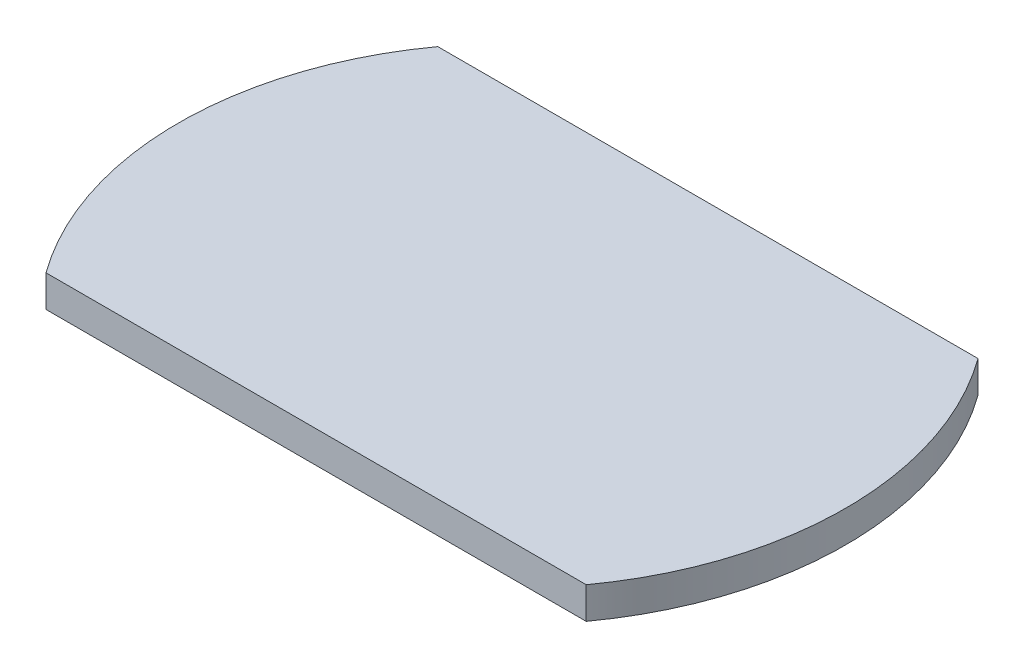
ISO-10303-21;
HEADER;
FILE_DESCRIPTION(('STEP AP214'),'2;1');
FILE_NAME('part.step','',(''),(''),'','','');
FILE_SCHEMA(('AUTOMOTIVE_DESIGN { 1 0 10303 214 1 1 1 1 }'));
ENDSEC;
DATA;
#1=APPLICATION_CONTEXT('core data for automotive mechanical design processes');
#2=APPLICATION_PROTOCOL_DEFINITION('international standard','automotive_design',2000,#1);
#3=PRODUCT_CONTEXT('',#1,'mechanical');
#4=PRODUCT('Part','Part','',(#3));
#5=PRODUCT_RELATED_PRODUCT_CATEGORY('part','',(#4));
#6=PRODUCT_DEFINITION_FORMATION('','',#4);
#7=PRODUCT_DEFINITION_CONTEXT('part definition',#1,'design');
#8=PRODUCT_DEFINITION('design','',#6,#7);
#9=PRODUCT_DEFINITION_SHAPE('','',#8);
#10=(LENGTH_UNIT() NAMED_UNIT(*) SI_UNIT(.MILLI.,.METRE.));
#11=(NAMED_UNIT(*) PLANE_ANGLE_UNIT() SI_UNIT($,.RADIAN.));
#12=(NAMED_UNIT(*) SI_UNIT($,.STERADIAN.) SOLID_ANGLE_UNIT());
#13=UNCERTAINTY_MEASURE_WITH_UNIT(LENGTH_MEASURE(1.E-05),#10,'distance_accuracy_value','');
#14=(GEOMETRIC_REPRESENTATION_CONTEXT(3) GLOBAL_UNCERTAINTY_ASSIGNED_CONTEXT((#13)) GLOBAL_UNIT_ASSIGNED_CONTEXT((#10,
#11,#12)) REPRESENTATION_CONTEXT('',''));
#15=CARTESIAN_POINT('',(0.,0.,0.));
#16=DIRECTION('',(0.,0.,1.));
#17=DIRECTION('',(1.,0.,0.));
#18=AXIS2_PLACEMENT_3D('',#15,#16,#17);
#19=CARTESIAN_POINT('',(0.,10.,1.11022302462516E-13));
#20=DIRECTION('',(0.,-1.,0.));
#21=DIRECTION('',(0.,0.,-1.));
#22=AXIS2_PLACEMENT_3D('',#19,#20,#21);
#23=CYLINDRICAL_SURFACE('',#22,105.);
#24=CARTESIAN_POINT('',(0.,0.,1.11022302462516E-13));
#25=DIRECTION('',(0.,1.,0.));
#26=DIRECTION('',(0.,0.,1.));
#27=AXIS2_PLACEMENT_3D('',#24,#25,#26);
#28=CIRCLE('',#27,105.);
#29=CARTESIAN_POINT('',(-85.,0.,-61.6441400296897));
#30=VERTEX_POINT('',#29);
#31=CARTESIAN_POINT('',(-85.,0.,61.6441400296898));
#32=VERTEX_POINT('',#31);
#33=EDGE_CURVE('E104',#30,#32,#28,.T.);
#34=ORIENTED_EDGE('',*,*,#33,.T.);
#35=DIRECTION('',(0.,-1.,0.));
#36=VECTOR('',#35,1.);
#37=CARTESIAN_POINT('',(-85.,10.,61.6441400296898));
#38=LINE('',#37,#36);
#39=CARTESIAN_POINT('',(-85.,10.,61.6441400296898));
#40=VERTEX_POINT('',#39);
#41=EDGE_CURVE('E11',#40,#32,#38,.T.);
#42=ORIENTED_EDGE('',*,*,#41,.F.);
#43=CARTESIAN_POINT('',(0.,10.,1.11022302462516E-13));
#44=DIRECTION('',(0.,1.,0.));
#45=DIRECTION('',(0.,0.,1.));
#46=AXIS2_PLACEMENT_3D('',#43,#44,#45);
#47=CIRCLE('',#46,105.);
#48=CARTESIAN_POINT('',(-85.,10.,-61.6441400296897));
#49=VERTEX_POINT('',#48);
#50=EDGE_CURVE('E92',#49,#40,#47,.T.);
#51=ORIENTED_EDGE('',*,*,#50,.F.);
#52=DIRECTION('',(0.,-1.,0.));
#53=VECTOR('',#52,1.);
#54=CARTESIAN_POINT('',(-85.,10.,-61.6441400296897));
#55=LINE('',#54,#53);
#56=EDGE_CURVE('E100',#49,#30,#55,.T.);
#57=ORIENTED_EDGE('',*,*,#56,.T.);
#58=EDGE_LOOP('',(#34,#42,#51,#57));
#59=FACE_BOUND('',#58,.T.);
#60=ADVANCED_FACE('F41',(#59),#23,.T.);
#61=CARTESIAN_POINT('',(-85.,10.,61.6441400296898));
#62=DIRECTION('',(0.,0.,-1.));
#63=DIRECTION('',(-1.,0.,0.));
#64=AXIS2_PLACEMENT_3D('',#61,#62,#63);
#65=PLANE('',#64);
#66=DIRECTION('',(1.,0.,0.));
#67=VECTOR('',#66,1.);
#68=CARTESIAN_POINT('',(-85.,0.,61.6441400296898));
#69=LINE('',#68,#67);
#70=CARTESIAN_POINT('',(85.,0.,61.6441400296898));
#71=VERTEX_POINT('',#70);
#72=EDGE_CURVE('E96',#32,#71,#69,.T.);
#73=ORIENTED_EDGE('',*,*,#72,.T.);
#74=DIRECTION('',(0.,-1.,0.));
#75=VECTOR('',#74,1.);
#76=CARTESIAN_POINT('',(85.,10.,61.6441400296898));
#77=LINE('',#76,#75);
#78=CARTESIAN_POINT('',(85.,10.,61.6441400296898));
#79=VERTEX_POINT('',#78);
#80=EDGE_CURVE('E49',#79,#71,#77,.T.);
#81=ORIENTED_EDGE('',*,*,#80,.F.);
#82=DIRECTION('',(1.,0.,0.));
#83=VECTOR('',#82,1.);
#84=CARTESIAN_POINT('',(-85.,10.,61.6441400296898));
#85=LINE('',#84,#83);
#86=EDGE_CURVE('E87',#40,#79,#85,.T.);
#87=ORIENTED_EDGE('',*,*,#86,.F.);
#88=ORIENTED_EDGE('',*,*,#41,.T.);
#89=EDGE_LOOP('',(#73,#81,#87,#88));
#90=FACE_BOUND('',#89,.T.);
#91=ADVANCED_FACE('F95',(#90),#65,.F.);
#92=CARTESIAN_POINT('',(0.,10.,1.11022302462516E-13));
#93=DIRECTION('',(0.,-1.,0.));
#94=DIRECTION('',(0.,0.,-1.));
#95=AXIS2_PLACEMENT_3D('',#92,#93,#94);
#96=CYLINDRICAL_SURFACE('',#95,105.);
#97=CARTESIAN_POINT('',(0.,0.,1.11022302462516E-13));
#98=DIRECTION('',(0.,1.,0.));
#99=DIRECTION('',(0.,0.,1.));
#100=AXIS2_PLACEMENT_3D('',#97,#98,#99);
#101=CIRCLE('',#100,105.);
#102=CARTESIAN_POINT('',(85.,0.,-61.6441400296896));
#103=VERTEX_POINT('',#102);
#104=EDGE_CURVE('E74',#71,#103,#101,.T.);
#105=ORIENTED_EDGE('',*,*,#104,.T.);
#106=DIRECTION('',(0.,-1.,0.));
#107=VECTOR('',#106,1.);
#108=CARTESIAN_POINT('',(85.,10.,-61.6441400296896));
#109=LINE('',#108,#107);
#110=CARTESIAN_POINT('',(85.,10.,-61.6441400296896));
#111=VERTEX_POINT('',#110);
#112=EDGE_CURVE('E97',#111,#103,#109,.T.);
#113=ORIENTED_EDGE('',*,*,#112,.F.);
#114=CARTESIAN_POINT('',(0.,10.,1.11022302462516E-13));
#115=DIRECTION('',(0.,1.,0.));
#116=DIRECTION('',(0.,0.,1.));
#117=AXIS2_PLACEMENT_3D('',#114,#115,#116);
#118=CIRCLE('',#117,105.);
#119=EDGE_CURVE('E90',#79,#111,#118,.T.);
#120=ORIENTED_EDGE('',*,*,#119,.F.);
#121=ORIENTED_EDGE('',*,*,#80,.T.);
#122=EDGE_LOOP('',(#105,#113,#120,#121));
#123=FACE_BOUND('',#122,.T.);
#124=ADVANCED_FACE('F98',(#123),#96,.T.);
#125=CARTESIAN_POINT('',(85.,10.,-61.6441400296897));
#126=DIRECTION('',(0.,0.,1.));
#127=DIRECTION('',(1.,0.,0.));
#128=AXIS2_PLACEMENT_3D('',#125,#126,#127);
#129=PLANE('',#128);
#130=DIRECTION('',(-1.,0.,0.));
#131=VECTOR('',#130,1.);
#132=CARTESIAN_POINT('',(85.,0.,-61.6441400296897));
#133=LINE('',#132,#131);
#134=EDGE_CURVE('E80',#103,#30,#133,.T.);
#135=ORIENTED_EDGE('',*,*,#134,.T.);
#136=ORIENTED_EDGE('',*,*,#56,.F.);
#137=DIRECTION('',(-1.,0.,0.));
#138=VECTOR('',#137,1.);
#139=CARTESIAN_POINT('',(85.,10.,-61.6441400296897));
#140=LINE('',#139,#138);
#141=EDGE_CURVE('E57',#111,#49,#140,.T.);
#142=ORIENTED_EDGE('',*,*,#141,.F.);
#143=ORIENTED_EDGE('',*,*,#112,.T.);
#144=EDGE_LOOP('',(#135,#136,#142,#143));
#145=FACE_BOUND('',#144,.T.);
#146=ADVANCED_FACE('F111',(#145),#129,.F.);
#147=CARTESIAN_POINT('',(0.,10.,1.11022302462516E-13));
#148=DIRECTION('',(0.,1.,0.));
#149=DIRECTION('',(0.,0.,1.));
#150=AXIS2_PLACEMENT_3D('',#147,#148,#149);
#151=PLANE('',#150);
#152=ORIENTED_EDGE('',*,*,#50,.T.);
#153=ORIENTED_EDGE('',*,*,#86,.T.);
#154=ORIENTED_EDGE('',*,*,#119,.T.);
#155=ORIENTED_EDGE('',*,*,#141,.T.);
#156=EDGE_LOOP('',(#152,#153,#154,#155));
#157=FACE_BOUND('',#156,.T.);
#158=ADVANCED_FACE('F88',(#157),#151,.T.);
#159=CARTESIAN_POINT('',(0.,0.,1.11022302462516E-13));
#160=DIRECTION('',(0.,1.,0.));
#161=DIRECTION('',(0.,0.,1.));
#162=AXIS2_PLACEMENT_3D('',#159,#160,#161);
#163=PLANE('',#162);
#164=ORIENTED_EDGE('',*,*,#33,.F.);
#165=ORIENTED_EDGE('',*,*,#134,.F.);
#166=ORIENTED_EDGE('',*,*,#104,.F.);
#167=ORIENTED_EDGE('',*,*,#72,.F.);
#168=EDGE_LOOP('',(#164,#165,#166,#167));
#169=FACE_BOUND('',#168,.T.);
#170=ADVANCED_FACE('F114',(#169),#163,.F.);
#171=CLOSED_SHELL('',(#60,#91,#124,#146,#158,#170));
#172=MANIFOLD_SOLID_BREP('B2',#171);
#173=ADVANCED_BREP_SHAPE_REPRESENTATION('',(#18,#172),#14);
#174=SHAPE_DEFINITION_REPRESENTATION(#9,#173);
ENDSEC;
END-ISO-10303-21;
